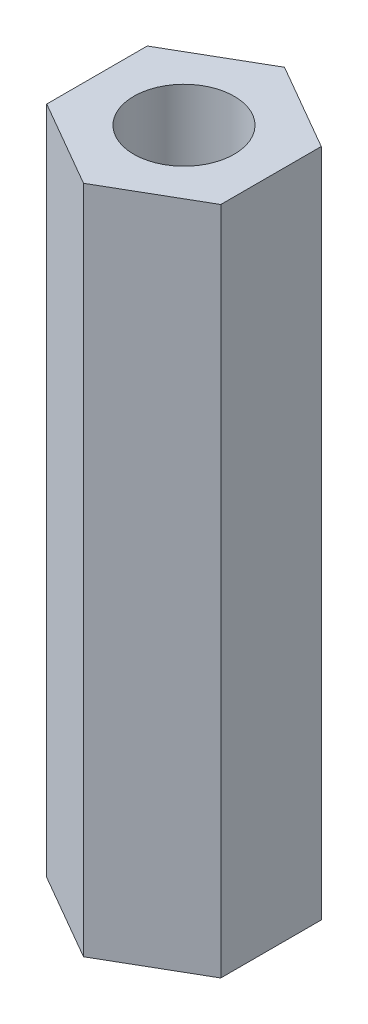
ISO-10303-21;
HEADER;
FILE_DESCRIPTION(('STEP AP214'),'2;1');
FILE_NAME('part.step','',(''),(''),'','','');
FILE_SCHEMA(('AUTOMOTIVE_DESIGN { 1 0 10303 214 1 1 1 1 }'));
ENDSEC;
DATA;
#1=APPLICATION_CONTEXT('core data for automotive mechanical design processes');
#2=APPLICATION_PROTOCOL_DEFINITION('international standard','automotive_design',2000,#1);
#3=PRODUCT_CONTEXT('',#1,'mechanical');
#4=PRODUCT('Part','Part','',(#3));
#5=PRODUCT_RELATED_PRODUCT_CATEGORY('part','',(#4));
#6=PRODUCT_DEFINITION_FORMATION('','',#4);
#7=PRODUCT_DEFINITION_CONTEXT('part definition',#1,'design');
#8=PRODUCT_DEFINITION('design','',#6,#7);
#9=PRODUCT_DEFINITION_SHAPE('','',#8);
#10=(LENGTH_UNIT() NAMED_UNIT(*) SI_UNIT(.MILLI.,.METRE.));
#11=(NAMED_UNIT(*) PLANE_ANGLE_UNIT() SI_UNIT($,.RADIAN.));
#12=(NAMED_UNIT(*) SI_UNIT($,.STERADIAN.) SOLID_ANGLE_UNIT());
#13=UNCERTAINTY_MEASURE_WITH_UNIT(LENGTH_MEASURE(1.E-05),#10,'distance_accuracy_value','');
#14=(GEOMETRIC_REPRESENTATION_CONTEXT(3) GLOBAL_UNCERTAINTY_ASSIGNED_CONTEXT((#13)) GLOBAL_UNIT_ASSIGNED_CONTEXT((#10,
#11,#12)) REPRESENTATION_CONTEXT('',''));
#15=CARTESIAN_POINT('',(0.,0.,0.));
#16=DIRECTION('',(0.,0.,1.));
#17=DIRECTION('',(1.,0.,0.));
#18=AXIS2_PLACEMENT_3D('',#15,#16,#17);
#19=CARTESIAN_POINT('',(-1.29903810567666,20.,2.25));
#20=DIRECTION('',(0.5,0.,-0.866025403784439));
#21=DIRECTION('',(-0.866025403784439,0.,-0.5));
#22=AXIS2_PLACEMENT_3D('',#19,#20,#21);
#23=PLANE('',#22);
#24=DIRECTION('',(0.866025403784439,0.,0.5));
#25=VECTOR('',#24,1.);
#26=CARTESIAN_POINT('',(-1.29903810567666,0.,2.25));
#27=LINE('',#26,#25);
#28=CARTESIAN_POINT('',(-2.59807621135332,0.,1.5));
#29=VERTEX_POINT('',#28);
#30=CARTESIAN_POINT('',(0.,0.,3.));
#31=VERTEX_POINT('',#30);
#32=EDGE_CURVE('E133',#29,#31,#27,.T.);
#33=ORIENTED_EDGE('',*,*,#32,.T.);
#34=DIRECTION('',(0.,-1.,0.));
#35=VECTOR('',#34,1.);
#36=CARTESIAN_POINT('',(0.,20.,3.));
#37=LINE('',#36,#35);
#38=CARTESIAN_POINT('',(0.,20.,3.));
#39=VERTEX_POINT('',#38);
#40=EDGE_CURVE('E11',#39,#31,#37,.T.);
#41=ORIENTED_EDGE('',*,*,#40,.F.);
#42=DIRECTION('',(0.866025403784439,0.,0.5));
#43=VECTOR('',#42,1.);
#44=CARTESIAN_POINT('',(-1.29903810567666,20.,2.25));
#45=LINE('',#44,#43);
#46=CARTESIAN_POINT('',(-2.59807621135332,20.,1.5));
#47=VERTEX_POINT('',#46);
#48=EDGE_CURVE('E169',#47,#39,#45,.T.);
#49=ORIENTED_EDGE('',*,*,#48,.F.);
#50=DIRECTION('',(0.,-1.,0.));
#51=VECTOR('',#50,1.);
#52=CARTESIAN_POINT('',(-2.59807621135332,20.,1.5));
#53=LINE('',#52,#51);
#54=EDGE_CURVE('E125',#47,#29,#53,.T.);
#55=ORIENTED_EDGE('',*,*,#54,.T.);
#56=EDGE_LOOP('',(#33,#41,#49,#55));
#57=FACE_BOUND('',#56,.T.);
#58=ADVANCED_FACE('F41',(#57),#23,.F.);
#59=CARTESIAN_POINT('',(1.29903810567666,20.,2.25));
#60=DIRECTION('',(-0.5,0.,-0.866025403784439));
#61=DIRECTION('',(-0.866025403784439,0.,0.5));
#62=AXIS2_PLACEMENT_3D('',#59,#60,#61);
#63=PLANE('',#62);
#64=DIRECTION('',(0.866025403784439,0.,-0.5));
#65=VECTOR('',#64,1.);
#66=CARTESIAN_POINT('',(1.29903810567666,0.,2.25));
#67=LINE('',#66,#65);
#68=CARTESIAN_POINT('',(2.59807621135332,0.,1.5));
#69=VERTEX_POINT('',#68);
#70=EDGE_CURVE('E137',#31,#69,#67,.T.);
#71=ORIENTED_EDGE('',*,*,#70,.T.);
#72=DIRECTION('',(0.,-1.,0.));
#73=VECTOR('',#72,1.);
#74=CARTESIAN_POINT('',(2.59807621135332,20.,1.5));
#75=LINE('',#74,#73);
#76=CARTESIAN_POINT('',(2.59807621135332,20.,1.5));
#77=VERTEX_POINT('',#76);
#78=EDGE_CURVE('E51',#77,#69,#75,.T.);
#79=ORIENTED_EDGE('',*,*,#78,.F.);
#80=DIRECTION('',(0.866025403784439,0.,-0.5));
#81=VECTOR('',#80,1.);
#82=CARTESIAN_POINT('',(1.29903810567666,20.,2.25));
#83=LINE('',#82,#81);
#84=EDGE_CURVE('E92',#39,#77,#83,.T.);
#85=ORIENTED_EDGE('',*,*,#84,.F.);
#86=ORIENTED_EDGE('',*,*,#40,.T.);
#87=EDGE_LOOP('',(#71,#79,#85,#86));
#88=FACE_BOUND('',#87,.T.);
#89=ADVANCED_FACE('F162',(#88),#63,.F.);
#90=CARTESIAN_POINT('',(2.59807621135332,20.,0.));
#91=DIRECTION('',(1.,0.,0.));
#92=DIRECTION('',(0.,0.,-1.));
#93=AXIS2_PLACEMENT_3D('',#90,#91,#92);
#94=PLANE('',#93);
#95=DIRECTION('',(0.,0.,1.));
#96=VECTOR('',#95,1.);
#97=CARTESIAN_POINT('',(2.59807621135332,0.,0.));
#98=LINE('',#97,#96);
#99=CARTESIAN_POINT('',(2.59807621135332,0.,-1.5));
#100=VERTEX_POINT('',#99);
#101=EDGE_CURVE('E141',#100,#69,#98,.T.);
#102=ORIENTED_EDGE('',*,*,#101,.F.);
#103=DIRECTION('',(0.,-1.,0.));
#104=VECTOR('',#103,1.);
#105=CARTESIAN_POINT('',(2.59807621135332,20.,-1.5));
#106=LINE('',#105,#104);
#107=CARTESIAN_POINT('',(2.59807621135332,20.,-1.5));
#108=VERTEX_POINT('',#107);
#109=EDGE_CURVE('E119',#108,#100,#106,.T.);
#110=ORIENTED_EDGE('',*,*,#109,.F.);
#111=DIRECTION('',(0.,0.,1.));
#112=VECTOR('',#111,1.);
#113=CARTESIAN_POINT('',(2.59807621135332,20.,0.));
#114=LINE('',#113,#112);
#115=EDGE_CURVE('E106',#108,#77,#114,.T.);
#116=ORIENTED_EDGE('',*,*,#115,.T.);
#117=ORIENTED_EDGE('',*,*,#78,.T.);
#118=EDGE_LOOP('',(#102,#110,#116,#117));
#119=FACE_BOUND('',#118,.T.);
#120=ADVANCED_FACE('F161',(#119),#94,.T.);
#121=CARTESIAN_POINT('',(1.29903810567666,20.,-2.25));
#122=DIRECTION('',(-0.5,0.,0.866025403784439));
#123=DIRECTION('',(0.866025403784439,0.,0.5));
#124=AXIS2_PLACEMENT_3D('',#121,#122,#123);
#125=PLANE('',#124);
#126=DIRECTION('',(-0.866025403784439,0.,-0.5));
#127=VECTOR('',#126,1.);
#128=CARTESIAN_POINT('',(1.29903810567666,0.,-2.25));
#129=LINE('',#128,#127);
#130=CARTESIAN_POINT('',(0.,0.,-3.));
#131=VERTEX_POINT('',#130);
#132=EDGE_CURVE('E114',#100,#131,#129,.T.);
#133=ORIENTED_EDGE('',*,*,#132,.T.);
#134=DIRECTION('',(0.,-1.,0.));
#135=VECTOR('',#134,1.);
#136=CARTESIAN_POINT('',(0.,20.,-3.));
#137=LINE('',#136,#135);
#138=CARTESIAN_POINT('',(0.,20.,-3.));
#139=VERTEX_POINT('',#138);
#140=EDGE_CURVE('E111',#139,#131,#137,.T.);
#141=ORIENTED_EDGE('',*,*,#140,.F.);
#142=DIRECTION('',(-0.866025403784439,0.,-0.5));
#143=VECTOR('',#142,1.);
#144=CARTESIAN_POINT('',(1.29903810567666,20.,-2.25));
#145=LINE('',#144,#143);
#146=EDGE_CURVE('E100',#108,#139,#145,.T.);
#147=ORIENTED_EDGE('',*,*,#146,.F.);
#148=ORIENTED_EDGE('',*,*,#109,.T.);
#149=EDGE_LOOP('',(#133,#141,#147,#148));
#150=FACE_BOUND('',#149,.T.);
#151=ADVANCED_FACE('F112',(#150),#125,.F.);
#152=CARTESIAN_POINT('',(-1.29903810567666,20.,-2.25));
#153=DIRECTION('',(-0.5,0.,-0.866025403784439));
#154=DIRECTION('',(-0.866025403784439,0.,0.5));
#155=AXIS2_PLACEMENT_3D('',#152,#153,#154);
#156=PLANE('',#155);
#157=DIRECTION('',(0.866025403784439,0.,-0.5));
#158=VECTOR('',#157,1.);
#159=CARTESIAN_POINT('',(-1.29903810567666,0.,-2.25));
#160=LINE('',#159,#158);
#161=CARTESIAN_POINT('',(-2.59807621135332,0.,-1.5));
#162=VERTEX_POINT('',#161);
#163=EDGE_CURVE('E147',#162,#131,#160,.T.);
#164=ORIENTED_EDGE('',*,*,#163,.F.);
#165=DIRECTION('',(0.,-1.,0.));
#166=VECTOR('',#165,1.);
#167=CARTESIAN_POINT('',(-2.59807621135332,20.,-1.5));
#168=LINE('',#167,#166);
#169=CARTESIAN_POINT('',(-2.59807621135332,20.,-1.5));
#170=VERTEX_POINT('',#169);
#171=EDGE_CURVE('E81',#170,#162,#168,.T.);
#172=ORIENTED_EDGE('',*,*,#171,.F.);
#173=DIRECTION('',(0.866025403784439,0.,-0.5));
#174=VECTOR('',#173,1.);
#175=CARTESIAN_POINT('',(-1.29903810567666,20.,-2.25));
#176=LINE('',#175,#174);
#177=EDGE_CURVE('E104',#170,#139,#176,.T.);
#178=ORIENTED_EDGE('',*,*,#177,.T.);
#179=ORIENTED_EDGE('',*,*,#140,.T.);
#180=EDGE_LOOP('',(#164,#172,#178,#179));
#181=FACE_BOUND('',#180,.T.);
#182=ADVANCED_FACE('F121',(#181),#156,.T.);
#183=CARTESIAN_POINT('',(0.,20.,0.));
#184=DIRECTION('',(0.,-1.,0.));
#185=DIRECTION('',(0.,0.,-1.));
#186=AXIS2_PLACEMENT_3D('',#183,#184,#185);
#187=CYLINDRICAL_SURFACE('',#186,1.5);
#188=CARTESIAN_POINT('',(0.,20.,0.));
#189=DIRECTION('',(0.,1.,0.));
#190=DIRECTION('',(0.,0.,1.));
#191=AXIS2_PLACEMENT_3D('',#188,#189,#190);
#192=CIRCLE('',#191,1.5);
#193=CARTESIAN_POINT('',(0.,20.,1.5));
#194=VERTEX_POINT('',#193);
#195=EDGE_CURVE('E152',#194,#194,#192,.T.);
#196=ORIENTED_EDGE('',*,*,#195,.T.);
#197=EDGE_LOOP('',(#196));
#198=FACE_BOUND('',#197,.T.);
#199=CARTESIAN_POINT('',(0.,0.,0.));
#200=DIRECTION('',(0.,1.,0.));
#201=DIRECTION('',(0.,0.,1.));
#202=AXIS2_PLACEMENT_3D('',#199,#200,#201);
#203=CIRCLE('',#202,1.5);
#204=CARTESIAN_POINT('',(0.,0.,1.5));
#205=VERTEX_POINT('',#204);
#206=EDGE_CURVE('E129',#205,#205,#203,.T.);
#207=ORIENTED_EDGE('',*,*,#206,.F.);
#208=EDGE_LOOP('',(#207));
#209=FACE_BOUND('',#208,.T.);
#210=ADVANCED_FACE('F43',(#198,#209),#187,.F.);
#211=CARTESIAN_POINT('',(-2.59807621135332,20.,0.));
#212=DIRECTION('',(1.,0.,0.));
#213=DIRECTION('',(0.,0.,-1.));
#214=AXIS2_PLACEMENT_3D('',#211,#212,#213);
#215=PLANE('',#214);
#216=DIRECTION('',(0.,0.,1.));
#217=VECTOR('',#216,1.);
#218=CARTESIAN_POINT('',(-2.59807621135332,0.,0.));
#219=LINE('',#218,#217);
#220=EDGE_CURVE('E84',#162,#29,#219,.T.);
#221=ORIENTED_EDGE('',*,*,#220,.T.);
#222=ORIENTED_EDGE('',*,*,#54,.F.);
#223=DIRECTION('',(0.,0.,1.));
#224=VECTOR('',#223,1.);
#225=CARTESIAN_POINT('',(-2.59807621135332,20.,0.));
#226=LINE('',#225,#224);
#227=EDGE_CURVE('E59',#170,#47,#226,.T.);
#228=ORIENTED_EDGE('',*,*,#227,.F.);
#229=ORIENTED_EDGE('',*,*,#171,.T.);
#230=EDGE_LOOP('',(#221,#222,#228,#229));
#231=FACE_BOUND('',#230,.T.);
#232=ADVANCED_FACE('F170',(#231),#215,.F.);
#233=CARTESIAN_POINT('',(0.,20.,0.));
#234=DIRECTION('',(0.,1.,0.));
#235=DIRECTION('',(0.,0.,1.));
#236=AXIS2_PLACEMENT_3D('',#233,#234,#235);
#237=PLANE('',#236);
#238=ORIENTED_EDGE('',*,*,#195,.F.);
#239=EDGE_LOOP('',(#238));
#240=FACE_BOUND('',#239,.T.);
#241=ORIENTED_EDGE('',*,*,#48,.T.);
#242=ORIENTED_EDGE('',*,*,#84,.T.);
#243=ORIENTED_EDGE('',*,*,#115,.F.);
#244=ORIENTED_EDGE('',*,*,#146,.T.);
#245=ORIENTED_EDGE('',*,*,#177,.F.);
#246=ORIENTED_EDGE('',*,*,#227,.T.);
#247=EDGE_LOOP('',(#241,#242,#243,#244,#245,#246));
#248=FACE_BOUND('',#247,.T.);
#249=ADVANCED_FACE('F102',(#240,#248),#237,.T.);
#250=CARTESIAN_POINT('',(0.,0.,0.));
#251=DIRECTION('',(0.,1.,0.));
#252=DIRECTION('',(0.,0.,1.));
#253=AXIS2_PLACEMENT_3D('',#250,#251,#252);
#254=PLANE('',#253);
#255=ORIENTED_EDGE('',*,*,#206,.T.);
#256=EDGE_LOOP('',(#255));
#257=FACE_BOUND('',#256,.T.);
#258=ORIENTED_EDGE('',*,*,#32,.F.);
#259=ORIENTED_EDGE('',*,*,#220,.F.);
#260=ORIENTED_EDGE('',*,*,#163,.T.);
#261=ORIENTED_EDGE('',*,*,#132,.F.);
#262=ORIENTED_EDGE('',*,*,#101,.T.);
#263=ORIENTED_EDGE('',*,*,#70,.F.);
#264=EDGE_LOOP('',(#258,#259,#260,#261,#262,#263));
#265=FACE_BOUND('',#264,.T.);
#266=ADVANCED_FACE('F166',(#257,#265),#254,.F.);
#267=CLOSED_SHELL('',(#58,#89,#120,#151,#182,#210,#232,#249,#266));
#268=MANIFOLD_SOLID_BREP('B2',#267);
#269=ADVANCED_BREP_SHAPE_REPRESENTATION('',(#18,#268),#14);
#270=SHAPE_DEFINITION_REPRESENTATION(#9,#269);
ENDSEC;
END-ISO-10303-21;
